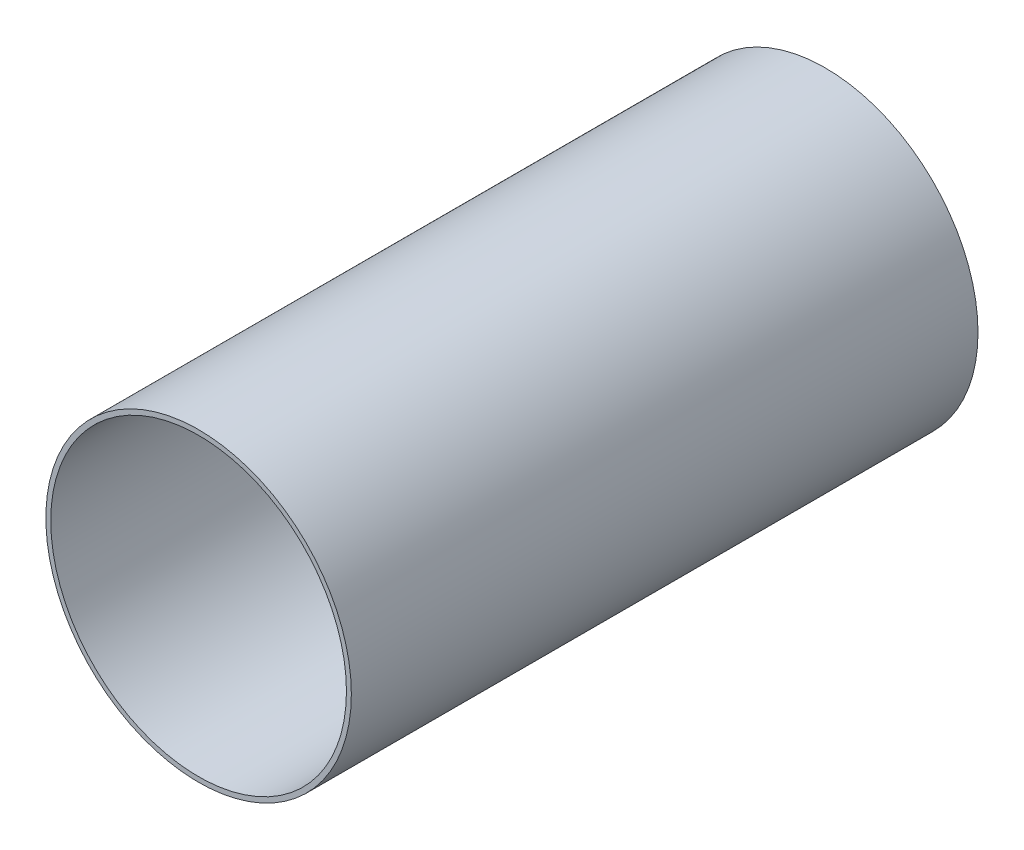
ISO-10303-21;
HEADER;
FILE_DESCRIPTION(('STEP AP214'),'2;1');
FILE_NAME('part.step','',(''),(''),'','','');
FILE_SCHEMA(('AUTOMOTIVE_DESIGN { 1 0 10303 214 1 1 1 1 }'));
ENDSEC;
DATA;
#1=APPLICATION_CONTEXT('core data for automotive mechanical design processes');
#2=APPLICATION_PROTOCOL_DEFINITION('international standard','automotive_design',2000,#1);
#3=PRODUCT_CONTEXT('',#1,'mechanical');
#4=PRODUCT('Part','Part','',(#3));
#5=PRODUCT_RELATED_PRODUCT_CATEGORY('part','',(#4));
#6=PRODUCT_DEFINITION_FORMATION('','',#4);
#7=PRODUCT_DEFINITION_CONTEXT('part definition',#1,'design');
#8=PRODUCT_DEFINITION('design','',#6,#7);
#9=PRODUCT_DEFINITION_SHAPE('','',#8);
#10=(LENGTH_UNIT() NAMED_UNIT(*) SI_UNIT(.MILLI.,.METRE.));
#11=(NAMED_UNIT(*) PLANE_ANGLE_UNIT() SI_UNIT($,.RADIAN.));
#12=(NAMED_UNIT(*) SI_UNIT($,.STERADIAN.) SOLID_ANGLE_UNIT());
#13=UNCERTAINTY_MEASURE_WITH_UNIT(LENGTH_MEASURE(1.E-05),#10,'distance_accuracy_value','');
#14=(GEOMETRIC_REPRESENTATION_CONTEXT(3) GLOBAL_UNCERTAINTY_ASSIGNED_CONTEXT((#13)) GLOBAL_UNIT_ASSIGNED_CONTEXT((#10,
#11,#12)) REPRESENTATION_CONTEXT('',''));
#15=CARTESIAN_POINT('',(0.,0.,0.));
#16=DIRECTION('',(0.,0.,1.));
#17=DIRECTION('',(1.,0.,0.));
#18=AXIS2_PLACEMENT_3D('',#15,#16,#17);
#19=CARTESIAN_POINT('',(0.,0.,203.2));
#20=DIRECTION('',(0.,0.,1.));
#21=DIRECTION('',(1.,0.,0.));
#22=AXIS2_PLACEMENT_3D('',#19,#20,#21);
#23=PLANE('',#22);
#24=CARTESIAN_POINT('',(0.,0.,203.2));
#25=DIRECTION('',(0.,0.,1.));
#26=DIRECTION('',(1.,0.,0.));
#27=AXIS2_PLACEMENT_3D('',#24,#25,#26);
#28=CIRCLE('',#27,49.53);
#29=CARTESIAN_POINT('',(49.53,0.,203.2));
#30=VERTEX_POINT('',#29);
#31=EDGE_CURVE('E10',#30,#30,#28,.T.);
#32=ORIENTED_EDGE('',*,*,#31,.T.);
#33=EDGE_LOOP('',(#32));
#34=FACE_BOUND('',#33,.T.);
#35=CARTESIAN_POINT('',(0.,0.,203.2));
#36=DIRECTION('',(0.,0.,1.));
#37=DIRECTION('',(1.,0.,0.));
#38=AXIS2_PLACEMENT_3D('',#35,#36,#37);
#39=CIRCLE('',#38,47.9425);
#40=CARTESIAN_POINT('',(47.9425,0.,203.2));
#41=VERTEX_POINT('',#40);
#42=EDGE_CURVE('E42',#41,#41,#39,.T.);
#43=ORIENTED_EDGE('',*,*,#42,.F.);
#44=EDGE_LOOP('',(#43));
#45=FACE_BOUND('',#44,.T.);
#46=ADVANCED_FACE('F31',(#34,#45),#23,.T.);
#47=CARTESIAN_POINT('',(0.,0.,0.));
#48=DIRECTION('',(0.,0.,1.));
#49=DIRECTION('',(1.,0.,0.));
#50=AXIS2_PLACEMENT_3D('',#47,#48,#49);
#51=PLANE('',#50);
#52=CARTESIAN_POINT('',(0.,0.,0.));
#53=DIRECTION('',(0.,0.,1.));
#54=DIRECTION('',(1.,0.,0.));
#55=AXIS2_PLACEMENT_3D('',#52,#53,#54);
#56=CIRCLE('',#55,49.53);
#57=CARTESIAN_POINT('',(49.53,0.,0.));
#58=VERTEX_POINT('',#57);
#59=EDGE_CURVE('E35',#58,#58,#56,.T.);
#60=ORIENTED_EDGE('',*,*,#59,.F.);
#61=EDGE_LOOP('',(#60));
#62=FACE_BOUND('',#61,.T.);
#63=CARTESIAN_POINT('',(0.,0.,0.));
#64=DIRECTION('',(0.,0.,1.));
#65=DIRECTION('',(1.,0.,0.));
#66=AXIS2_PLACEMENT_3D('',#63,#64,#65);
#67=CIRCLE('',#66,47.9425);
#68=CARTESIAN_POINT('',(47.9425,0.,0.));
#69=VERTEX_POINT('',#68);
#70=EDGE_CURVE('E44',#69,#69,#67,.T.);
#71=ORIENTED_EDGE('',*,*,#70,.T.);
#72=EDGE_LOOP('',(#71));
#73=FACE_BOUND('',#72,.T.);
#74=ADVANCED_FACE('F54',(#62,#73),#51,.F.);
#75=CARTESIAN_POINT('',(0.,0.,203.2));
#76=DIRECTION('',(0.,0.,-1.));
#77=DIRECTION('',(-1.,0.,0.));
#78=AXIS2_PLACEMENT_3D('',#75,#76,#77);
#79=CYLINDRICAL_SURFACE('',#78,49.53);
#80=ORIENTED_EDGE('',*,*,#31,.F.);
#81=EDGE_LOOP('',(#80));
#82=FACE_BOUND('',#81,.T.);
#83=ORIENTED_EDGE('',*,*,#59,.T.);
#84=EDGE_LOOP('',(#83));
#85=FACE_BOUND('',#84,.T.);
#86=ADVANCED_FACE('F33',(#82,#85),#79,.T.);
#87=CARTESIAN_POINT('',(0.,0.,203.2));
#88=DIRECTION('',(0.,0.,-1.));
#89=DIRECTION('',(-1.,0.,0.));
#90=AXIS2_PLACEMENT_3D('',#87,#88,#89);
#91=CYLINDRICAL_SURFACE('',#90,47.9425);
#92=ORIENTED_EDGE('',*,*,#42,.T.);
#93=EDGE_LOOP('',(#92));
#94=FACE_BOUND('',#93,.T.);
#95=ORIENTED_EDGE('',*,*,#70,.F.);
#96=EDGE_LOOP('',(#95));
#97=FACE_BOUND('',#96,.T.);
#98=ADVANCED_FACE('F50',(#94,#97),#91,.F.);
#99=CLOSED_SHELL('',(#46,#74,#86,#98));
#100=MANIFOLD_SOLID_BREP('B2',#99);
#101=ADVANCED_BREP_SHAPE_REPRESENTATION('',(#18,#100),#14);
#102=SHAPE_DEFINITION_REPRESENTATION(#9,#101);
ENDSEC;
END-ISO-10303-21;
